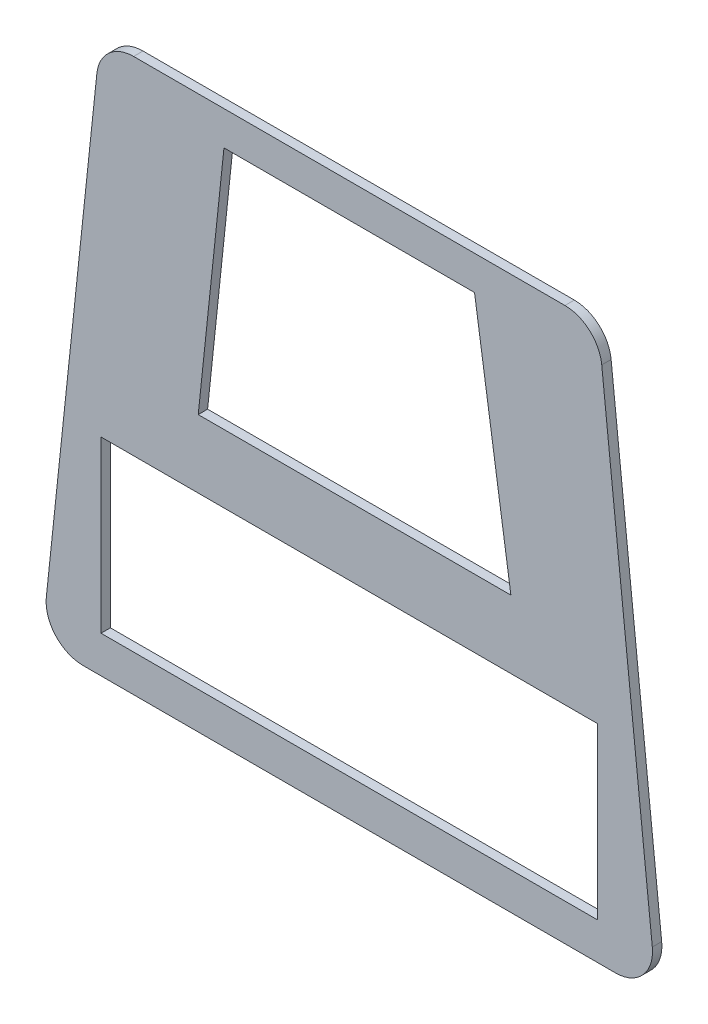
ISO-10303-21;
HEADER;
FILE_DESCRIPTION(('STEP AP214'),'2;1');
FILE_NAME('part.step','',(''),(''),'','','');
FILE_SCHEMA(('AUTOMOTIVE_DESIGN { 1 0 10303 214 1 1 1 1 }'));
ENDSEC;
DATA;
#1=APPLICATION_CONTEXT('core data for automotive mechanical design processes');
#2=APPLICATION_PROTOCOL_DEFINITION('international standard','automotive_design',2000,#1);
#3=PRODUCT_CONTEXT('',#1,'mechanical');
#4=PRODUCT('Part','Part','',(#3));
#5=PRODUCT_RELATED_PRODUCT_CATEGORY('part','',(#4));
#6=PRODUCT_DEFINITION_FORMATION('','',#4);
#7=PRODUCT_DEFINITION_CONTEXT('part definition',#1,'design');
#8=PRODUCT_DEFINITION('design','',#6,#7);
#9=PRODUCT_DEFINITION_SHAPE('','',#8);
#10=(LENGTH_UNIT() NAMED_UNIT(*) SI_UNIT(.MILLI.,.METRE.));
#11=(NAMED_UNIT(*) PLANE_ANGLE_UNIT() SI_UNIT($,.RADIAN.));
#12=(NAMED_UNIT(*) SI_UNIT($,.STERADIAN.) SOLID_ANGLE_UNIT());
#13=UNCERTAINTY_MEASURE_WITH_UNIT(LENGTH_MEASURE(1.E-05),#10,'distance_accuracy_value','');
#14=(GEOMETRIC_REPRESENTATION_CONTEXT(3) GLOBAL_UNCERTAINTY_ASSIGNED_CONTEXT((#13)) GLOBAL_UNIT_ASSIGNED_CONTEXT((#10,
#11,#12)) REPRESENTATION_CONTEXT('',''));
#15=CARTESIAN_POINT('',(0.,0.,0.));
#16=DIRECTION('',(0.,0.,1.));
#17=DIRECTION('',(1.,0.,0.));
#18=AXIS2_PLACEMENT_3D('',#15,#16,#17);
#19=CARTESIAN_POINT('',(180.142857142854,-243.5,6.35));
#20=DIRECTION('',(0.,0.,1.));
#21=DIRECTION('',(1.,0.,0.));
#22=AXIS2_PLACEMENT_3D('',#19,#20,#21);
#23=PLANE('',#22);
#24=DIRECTION('',(-0.105006313285611,-0.994471555234319,0.));
#25=VECTOR('',#24,1.);
#26=CARTESIAN_POINT('',(-84.799938232529,82.5,6.35));
#27=LINE('',#26,#25);
#28=CARTESIAN_POINT('',(-84.799938232529,82.5,6.35));
#29=VERTEX_POINT('',#28);
#30=CARTESIAN_POINT('',(-102.222298480976,-82.5,6.35));
#31=VERTEX_POINT('',#30);
#32=EDGE_CURVE('E48',#29,#31,#27,.T.);
#33=ORIENTED_EDGE('',*,*,#32,.F.);
#34=DIRECTION('',(-1.,0.,0.));
#35=VECTOR('',#34,1.);
#36=CARTESIAN_POINT('',(84.7239626245148,82.5,6.35));
#37=LINE('',#36,#35);
#38=CARTESIAN_POINT('',(84.7239626245148,82.5,6.35));
#39=VERTEX_POINT('',#38);
#40=EDGE_CURVE('E164',#39,#29,#37,.T.);
#41=ORIENTED_EDGE('',*,*,#40,.F.);
#42=DIRECTION('',(-0.147439173889975,0.989071124845247,0.));
#43=VECTOR('',#42,1.);
#44=CARTESIAN_POINT('',(109.32023591644,-82.5,6.35));
#45=LINE('',#44,#43);
#46=CARTESIAN_POINT('',(109.32023591644,-82.5,6.35));
#47=VERTEX_POINT('',#46);
#48=EDGE_CURVE('E167',#47,#39,#45,.T.);
#49=ORIENTED_EDGE('',*,*,#48,.F.);
#50=DIRECTION('',(1.,0.,0.));
#51=VECTOR('',#50,1.);
#52=CARTESIAN_POINT('',(-102.222298480976,-82.5,6.35));
#53=LINE('',#52,#51);
#54=EDGE_CURVE('E173',#31,#47,#53,.T.);
#55=ORIENTED_EDGE('',*,*,#54,.F.);
#56=EDGE_LOOP('',(#33,#41,#49,#55));
#57=FACE_BOUND('',#56,.T.);
#58=CARTESIAN_POINT('',(180.142857142854,-243.5,6.35));
#59=DIRECTION('',(0.,0.,1.));
#60=DIRECTION('',(1.,0.,0.));
#61=AXIS2_PLACEMENT_3D('',#58,#59,#60);
#62=CIRCLE('',#61,25.0000000000015);
#63=CARTESIAN_POINT('',(180.142857142854,-268.5,6.35));
#64=VERTEX_POINT('',#63);
#65=CARTESIAN_POINT('',(205.004646023715,-240.87484216786,6.35));
#66=VERTEX_POINT('',#65);
#67=EDGE_CURVE('E214',#64,#66,#62,.T.);
#68=ORIENTED_EDGE('',*,*,#67,.T.);
#69=DIRECTION('',(-0.105006313285609,0.994471555234319,0.));
#70=VECTOR('',#69,1.);
#71=CARTESIAN_POINT('',(205.004646023715,-240.87484216786,6.35));
#72=LINE('',#71,#70);
#73=CARTESIAN_POINT('',(170.793465899491,83.1251578321402,6.35));
#74=VERTEX_POINT('',#73);
#75=EDGE_CURVE('E217',#66,#74,#72,.T.);
#76=ORIENTED_EDGE('',*,*,#75,.T.);
#77=CARTESIAN_POINT('',(145.931677018633,80.5,6.35));
#78=DIRECTION('',(0.,0.,1.));
#79=DIRECTION('',(-1.,0.,0.));
#80=AXIS2_PLACEMENT_3D('',#77,#78,#79);
#81=CIRCLE('',#80,25.0000000000001);
#82=CARTESIAN_POINT('',(145.931677018633,105.5,6.35));
#83=VERTEX_POINT('',#82);
#84=EDGE_CURVE('E220',#74,#83,#81,.T.);
#85=ORIENTED_EDGE('',*,*,#84,.T.);
#86=DIRECTION('',(-1.,0.,0.));
#87=VECTOR('',#86,1.);
#88=CARTESIAN_POINT('',(145.931677018633,105.5,6.35));
#89=LINE('',#88,#87);
#90=CARTESIAN_POINT('',(-145.931677018633,105.5,6.35));
#91=VERTEX_POINT('',#90);
#92=EDGE_CURVE('E222',#83,#91,#89,.T.);
#93=ORIENTED_EDGE('',*,*,#92,.T.);
#94=CARTESIAN_POINT('',(-145.931677018634,80.4999999999999,6.35));
#95=DIRECTION('',(0.,0.,1.));
#96=DIRECTION('',(1.,0.,0.));
#97=AXIS2_PLACEMENT_3D('',#94,#95,#96);
#98=CIRCLE('',#97,25.);
#99=CARTESIAN_POINT('',(-170.793465899492,83.1251578321401,6.35));
#100=VERTEX_POINT('',#99);
#101=EDGE_CURVE('E224',#91,#100,#98,.T.);
#102=ORIENTED_EDGE('',*,*,#101,.T.);
#103=DIRECTION('',(-0.105006313285611,-0.994471555234319,0.));
#104=VECTOR('',#103,1.);
#105=CARTESIAN_POINT('',(-170.793465899492,83.1251578321401,6.35));
#106=LINE('',#105,#104);
#107=CARTESIAN_POINT('',(-205.004646023715,-240.87484216786,6.35));
#108=VERTEX_POINT('',#107);
#109=EDGE_CURVE('E226',#100,#108,#106,.T.);
#110=ORIENTED_EDGE('',*,*,#109,.T.);
#111=CARTESIAN_POINT('',(-180.142857142857,-243.5,6.35));
#112=DIRECTION('',(0.,0.,1.));
#113=DIRECTION('',(1.,0.,0.));
#114=AXIS2_PLACEMENT_3D('',#111,#112,#113);
#115=CIRCLE('',#114,25.);
#116=CARTESIAN_POINT('',(-180.142857142857,-268.5,6.35));
#117=VERTEX_POINT('',#116);
#118=EDGE_CURVE('E228',#108,#117,#115,.T.);
#119=ORIENTED_EDGE('',*,*,#118,.T.);
#120=DIRECTION('',(1.,0.,0.));
#121=VECTOR('',#120,1.);
#122=CARTESIAN_POINT('',(-180.142857142857,-268.5,6.35));
#123=LINE('',#122,#121);
#124=EDGE_CURVE('E230',#117,#64,#123,.T.);
#125=ORIENTED_EDGE('',*,*,#124,.T.);
#126=EDGE_LOOP('',(#68,#76,#85,#93,#102,#110,#119,#125));
#127=FACE_BOUND('',#126,.T.);
#128=DIRECTION('',(1.,0.,0.));
#129=VECTOR('',#128,1.);
#130=CARTESIAN_POINT('',(-168.,-243.5,6.35));
#131=LINE('',#130,#129);
#132=CARTESIAN_POINT('',(-168.,-243.5,6.35));
#133=VERTEX_POINT('',#132);
#134=CARTESIAN_POINT('',(168.,-243.5,6.35));
#135=VERTEX_POINT('',#134);
#136=EDGE_CURVE('E185',#133,#135,#131,.T.);
#137=ORIENTED_EDGE('',*,*,#136,.F.);
#138=DIRECTION('',(0.,-1.,0.));
#139=VECTOR('',#138,1.);
#140=CARTESIAN_POINT('',(-168.,-128.5,6.35));
#141=LINE('',#140,#139);
#142=CARTESIAN_POINT('',(-168.,-128.5,6.35));
#143=VERTEX_POINT('',#142);
#144=EDGE_CURVE('E183',#143,#133,#141,.T.);
#145=ORIENTED_EDGE('',*,*,#144,.F.);
#146=DIRECTION('',(-1.,0.,0.));
#147=VECTOR('',#146,1.);
#148=CARTESIAN_POINT('',(-168.,-128.5,6.35));
#149=LINE('',#148,#147);
#150=CARTESIAN_POINT('',(168.,-128.5,6.35));
#151=VERTEX_POINT('',#150);
#152=EDGE_CURVE('E191',#151,#143,#149,.T.);
#153=ORIENTED_EDGE('',*,*,#152,.F.);
#154=DIRECTION('',(0.,1.,0.));
#155=VECTOR('',#154,1.);
#156=CARTESIAN_POINT('',(168.,-128.5,6.35));
#157=LINE('',#156,#155);
#158=EDGE_CURVE('E188',#135,#151,#157,.T.);
#159=ORIENTED_EDGE('',*,*,#158,.F.);
#160=EDGE_LOOP('',(#137,#145,#153,#159));
#161=FACE_BOUND('',#160,.T.);
#162=ADVANCED_FACE('F33',(#57,#127,#161),#23,.T.);
#163=CARTESIAN_POINT('',(180.142857142854,-243.5,0.));
#164=DIRECTION('',(0.,0.,1.));
#165=DIRECTION('',(1.,0.,0.));
#166=AXIS2_PLACEMENT_3D('',#163,#164,#165);
#167=PLANE('',#166);
#168=DIRECTION('',(-1.,0.,0.));
#169=VECTOR('',#168,1.);
#170=CARTESIAN_POINT('',(84.7239626245148,82.5,0.));
#171=LINE('',#170,#169);
#172=CARTESIAN_POINT('',(84.7239626245148,82.5,0.));
#173=VERTEX_POINT('',#172);
#174=CARTESIAN_POINT('',(-84.799938232529,82.5,0.));
#175=VERTEX_POINT('',#174);
#176=EDGE_CURVE('E154',#173,#175,#171,.T.);
#177=ORIENTED_EDGE('',*,*,#176,.T.);
#178=DIRECTION('',(-0.105006313285611,-0.994471555234319,0.));
#179=VECTOR('',#178,1.);
#180=CARTESIAN_POINT('',(-84.799938232529,82.5,0.));
#181=LINE('',#180,#179);
#182=CARTESIAN_POINT('',(-102.222298480976,-82.5,0.));
#183=VERTEX_POINT('',#182);
#184=EDGE_CURVE('E148',#175,#183,#181,.T.);
#185=ORIENTED_EDGE('',*,*,#184,.T.);
#186=DIRECTION('',(1.,0.,0.));
#187=VECTOR('',#186,1.);
#188=CARTESIAN_POINT('',(-102.222298480976,-82.5,0.));
#189=LINE('',#188,#187);
#190=CARTESIAN_POINT('',(109.32023591644,-82.5,0.));
#191=VERTEX_POINT('',#190);
#192=EDGE_CURVE('E157',#183,#191,#189,.T.);
#193=ORIENTED_EDGE('',*,*,#192,.T.);
#194=DIRECTION('',(-0.147439173889975,0.989071124845247,0.));
#195=VECTOR('',#194,1.);
#196=CARTESIAN_POINT('',(109.32023591644,-82.5,0.));
#197=LINE('',#196,#195);
#198=EDGE_CURVE('E56',#191,#173,#197,.T.);
#199=ORIENTED_EDGE('',*,*,#198,.T.);
#200=EDGE_LOOP('',(#177,#185,#193,#199));
#201=FACE_BOUND('',#200,.T.);
#202=CARTESIAN_POINT('',(180.142857142854,-243.5,0.));
#203=DIRECTION('',(0.,0.,1.));
#204=DIRECTION('',(1.,0.,0.));
#205=AXIS2_PLACEMENT_3D('',#202,#203,#204);
#206=CIRCLE('',#205,25.0000000000015);
#207=CARTESIAN_POINT('',(180.142857142854,-268.5,0.));
#208=VERTEX_POINT('',#207);
#209=CARTESIAN_POINT('',(205.004646023715,-240.87484216786,0.));
#210=VERTEX_POINT('',#209);
#211=EDGE_CURVE('E213',#208,#210,#206,.T.);
#212=ORIENTED_EDGE('',*,*,#211,.F.);
#213=DIRECTION('',(1.,0.,0.));
#214=VECTOR('',#213,1.);
#215=CARTESIAN_POINT('',(-180.142857142857,-268.5,0.));
#216=LINE('',#215,#214);
#217=CARTESIAN_POINT('',(-180.142857142857,-268.5,0.));
#218=VERTEX_POINT('',#217);
#219=EDGE_CURVE('E218',#218,#208,#216,.T.);
#220=ORIENTED_EDGE('',*,*,#219,.F.);
#221=CARTESIAN_POINT('',(-180.142857142857,-243.5,0.));
#222=DIRECTION('',(0.,0.,1.));
#223=DIRECTION('',(1.,0.,0.));
#224=AXIS2_PLACEMENT_3D('',#221,#222,#223);
#225=CIRCLE('',#224,25.);
#226=CARTESIAN_POINT('',(-205.004646023715,-240.87484216786,0.));
#227=VERTEX_POINT('',#226);
#228=EDGE_CURVE('E245',#227,#218,#225,.T.);
#229=ORIENTED_EDGE('',*,*,#228,.F.);
#230=DIRECTION('',(-0.105006313285611,-0.994471555234319,0.));
#231=VECTOR('',#230,1.);
#232=CARTESIAN_POINT('',(-170.793465899492,83.1251578321401,0.));
#233=LINE('',#232,#231);
#234=CARTESIAN_POINT('',(-170.793465899492,83.1251578321401,0.));
#235=VERTEX_POINT('',#234);
#236=EDGE_CURVE('E243',#235,#227,#233,.T.);
#237=ORIENTED_EDGE('',*,*,#236,.F.);
#238=CARTESIAN_POINT('',(-145.931677018634,80.4999999999999,0.));
#239=DIRECTION('',(0.,0.,1.));
#240=DIRECTION('',(1.,0.,0.));
#241=AXIS2_PLACEMENT_3D('',#238,#239,#240);
#242=CIRCLE('',#241,25.);
#243=CARTESIAN_POINT('',(-145.931677018633,105.5,0.));
#244=VERTEX_POINT('',#243);
#245=EDGE_CURVE('E241',#244,#235,#242,.T.);
#246=ORIENTED_EDGE('',*,*,#245,.F.);
#247=DIRECTION('',(-1.,0.,0.));
#248=VECTOR('',#247,1.);
#249=CARTESIAN_POINT('',(145.931677018633,105.5,0.));
#250=LINE('',#249,#248);
#251=CARTESIAN_POINT('',(145.931677018633,105.5,0.));
#252=VERTEX_POINT('',#251);
#253=EDGE_CURVE('E239',#252,#244,#250,.T.);
#254=ORIENTED_EDGE('',*,*,#253,.F.);
#255=CARTESIAN_POINT('',(145.931677018633,80.5,0.));
#256=DIRECTION('',(0.,0.,1.));
#257=DIRECTION('',(-1.,0.,0.));
#258=AXIS2_PLACEMENT_3D('',#255,#256,#257);
#259=CIRCLE('',#258,25.0000000000001);
#260=CARTESIAN_POINT('',(170.793465899491,83.1251578321402,0.));
#261=VERTEX_POINT('',#260);
#262=EDGE_CURVE('E237',#261,#252,#259,.T.);
#263=ORIENTED_EDGE('',*,*,#262,.F.);
#264=DIRECTION('',(-0.105006313285609,0.994471555234319,0.));
#265=VECTOR('',#264,1.);
#266=CARTESIAN_POINT('',(205.004646023715,-240.87484216786,0.));
#267=LINE('',#266,#265);
#268=EDGE_CURVE('E235',#210,#261,#267,.T.);
#269=ORIENTED_EDGE('',*,*,#268,.F.);
#270=EDGE_LOOP('',(#212,#220,#229,#237,#246,#254,#263,#269));
#271=FACE_BOUND('',#270,.T.);
#272=DIRECTION('',(0.,-1.,0.));
#273=VECTOR('',#272,1.);
#274=CARTESIAN_POINT('',(-168.,-128.5,0.));
#275=LINE('',#274,#273);
#276=CARTESIAN_POINT('',(-168.,-128.5,0.));
#277=VERTEX_POINT('',#276);
#278=CARTESIAN_POINT('',(-168.,-243.5,0.));
#279=VERTEX_POINT('',#278);
#280=EDGE_CURVE('E179',#277,#279,#275,.T.);
#281=ORIENTED_EDGE('',*,*,#280,.T.);
#282=DIRECTION('',(1.,0.,0.));
#283=VECTOR('',#282,1.);
#284=CARTESIAN_POINT('',(-168.,-243.5,0.));
#285=LINE('',#284,#283);
#286=CARTESIAN_POINT('',(168.,-243.5,0.));
#287=VERTEX_POINT('',#286);
#288=EDGE_CURVE('E196',#279,#287,#285,.T.);
#289=ORIENTED_EDGE('',*,*,#288,.T.);
#290=DIRECTION('',(0.,1.,0.));
#291=VECTOR('',#290,1.);
#292=CARTESIAN_POINT('',(168.,-128.5,0.));
#293=LINE('',#292,#291);
#294=CARTESIAN_POINT('',(168.,-128.5,0.));
#295=VERTEX_POINT('',#294);
#296=EDGE_CURVE('E199',#287,#295,#293,.T.);
#297=ORIENTED_EDGE('',*,*,#296,.T.);
#298=DIRECTION('',(-1.,0.,0.));
#299=VECTOR('',#298,1.);
#300=CARTESIAN_POINT('',(-168.,-128.5,0.));
#301=LINE('',#300,#299);
#302=EDGE_CURVE('E186',#295,#277,#301,.T.);
#303=ORIENTED_EDGE('',*,*,#302,.T.);
#304=EDGE_LOOP('',(#281,#289,#297,#303));
#305=FACE_BOUND('',#304,.T.);
#306=ADVANCED_FACE('F161',(#201,#271,#305),#167,.F.);
#307=CARTESIAN_POINT('',(180.142857142854,-243.5,6.35));
#308=DIRECTION('',(0.,0.,-1.));
#309=DIRECTION('',(-1.,0.,0.));
#310=AXIS2_PLACEMENT_3D('',#307,#308,#309);
#311=CYLINDRICAL_SURFACE('',#310,25.0000000000015);
#312=ORIENTED_EDGE('',*,*,#211,.T.);
#313=DIRECTION('',(0.,0.,-1.));
#314=VECTOR('',#313,1.);
#315=CARTESIAN_POINT('',(205.004646023715,-240.87484216786,6.35));
#316=LINE('',#315,#314);
#317=EDGE_CURVE('E11',#66,#210,#316,.T.);
#318=ORIENTED_EDGE('',*,*,#317,.F.);
#319=ORIENTED_EDGE('',*,*,#67,.F.);
#320=DIRECTION('',(0.,0.,-1.));
#321=VECTOR('',#320,1.);
#322=CARTESIAN_POINT('',(180.142857142854,-268.5,6.35));
#323=LINE('',#322,#321);
#324=EDGE_CURVE('E232',#64,#208,#323,.T.);
#325=ORIENTED_EDGE('',*,*,#324,.T.);
#326=EDGE_LOOP('',(#312,#318,#319,#325));
#327=FACE_BOUND('',#326,.T.);
#328=ADVANCED_FACE('F35',(#327),#311,.T.);
#329=CARTESIAN_POINT('',(205.004646023715,-240.87484216786,6.35));
#330=DIRECTION('',(-0.994471555234319,-0.105006313285609,0.));
#331=DIRECTION('',(0.105006313285609,-0.994471555234319,0.));
#332=AXIS2_PLACEMENT_3D('',#329,#330,#331);
#333=PLANE('',#332);
#334=ORIENTED_EDGE('',*,*,#268,.T.);
#335=DIRECTION('',(0.,0.,-1.));
#336=VECTOR('',#335,1.);
#337=CARTESIAN_POINT('',(170.793465899491,83.1251578321402,6.35));
#338=LINE('',#337,#336);
#339=EDGE_CURVE('E41',#74,#261,#338,.T.);
#340=ORIENTED_EDGE('',*,*,#339,.F.);
#341=ORIENTED_EDGE('',*,*,#75,.F.);
#342=ORIENTED_EDGE('',*,*,#317,.T.);
#343=EDGE_LOOP('',(#334,#340,#341,#342));
#344=FACE_BOUND('',#343,.T.);
#345=ADVANCED_FACE('F291',(#344),#333,.F.);
#346=CARTESIAN_POINT('',(145.931677018633,80.5,6.35));
#347=DIRECTION('',(0.,0.,-1.));
#348=DIRECTION('',(-1.,0.,0.));
#349=AXIS2_PLACEMENT_3D('',#346,#347,#348);
#350=CYLINDRICAL_SURFACE('',#349,25.0000000000001);
#351=ORIENTED_EDGE('',*,*,#262,.T.);
#352=DIRECTION('',(0.,0.,-1.));
#353=VECTOR('',#352,1.);
#354=CARTESIAN_POINT('',(145.931677018633,105.5,6.35));
#355=LINE('',#354,#353);
#356=EDGE_CURVE('E262',#83,#252,#355,.T.);
#357=ORIENTED_EDGE('',*,*,#356,.F.);
#358=ORIENTED_EDGE('',*,*,#84,.F.);
#359=ORIENTED_EDGE('',*,*,#339,.T.);
#360=EDGE_LOOP('',(#351,#357,#358,#359));
#361=FACE_BOUND('',#360,.T.);
#362=ADVANCED_FACE('F269',(#361),#350,.T.);
#363=CARTESIAN_POINT('',(145.931677018633,105.5,6.35));
#364=DIRECTION('',(0.,-1.,0.));
#365=DIRECTION('',(1.,0.,0.));
#366=AXIS2_PLACEMENT_3D('',#363,#364,#365);
#367=PLANE('',#366);
#368=ORIENTED_EDGE('',*,*,#253,.T.);
#369=DIRECTION('',(0.,0.,-1.));
#370=VECTOR('',#369,1.);
#371=CARTESIAN_POINT('',(-145.931677018633,105.5,6.35));
#372=LINE('',#371,#370);
#373=EDGE_CURVE('E259',#91,#244,#372,.T.);
#374=ORIENTED_EDGE('',*,*,#373,.F.);
#375=ORIENTED_EDGE('',*,*,#92,.F.);
#376=ORIENTED_EDGE('',*,*,#356,.T.);
#377=EDGE_LOOP('',(#368,#374,#375,#376));
#378=FACE_BOUND('',#377,.T.);
#379=ADVANCED_FACE('F279',(#378),#367,.F.);
#380=CARTESIAN_POINT('',(-145.931677018634,80.4999999999999,6.35));
#381=DIRECTION('',(0.,0.,-1.));
#382=DIRECTION('',(-1.,0.,0.));
#383=AXIS2_PLACEMENT_3D('',#380,#381,#382);
#384=CYLINDRICAL_SURFACE('',#383,25.);
#385=ORIENTED_EDGE('',*,*,#245,.T.);
#386=DIRECTION('',(0.,0.,-1.));
#387=VECTOR('',#386,1.);
#388=CARTESIAN_POINT('',(-170.793465899492,83.1251578321401,6.35));
#389=LINE('',#388,#387);
#390=EDGE_CURVE('E256',#100,#235,#389,.T.);
#391=ORIENTED_EDGE('',*,*,#390,.F.);
#392=ORIENTED_EDGE('',*,*,#101,.F.);
#393=ORIENTED_EDGE('',*,*,#373,.T.);
#394=EDGE_LOOP('',(#385,#391,#392,#393));
#395=FACE_BOUND('',#394,.T.);
#396=ADVANCED_FACE('F283',(#395),#384,.T.);
#397=CARTESIAN_POINT('',(-170.793465899492,83.1251578321401,6.35));
#398=DIRECTION('',(0.994471555234319,-0.105006313285611,0.));
#399=DIRECTION('',(0.105006313285611,0.994471555234319,0.));
#400=AXIS2_PLACEMENT_3D('',#397,#398,#399);
#401=PLANE('',#400);
#402=ORIENTED_EDGE('',*,*,#236,.T.);
#403=DIRECTION('',(0.,0.,-1.));
#404=VECTOR('',#403,1.);
#405=CARTESIAN_POINT('',(-205.004646023715,-240.87484216786,6.35));
#406=LINE('',#405,#404);
#407=EDGE_CURVE('E253',#108,#227,#406,.T.);
#408=ORIENTED_EDGE('',*,*,#407,.F.);
#409=ORIENTED_EDGE('',*,*,#109,.F.);
#410=ORIENTED_EDGE('',*,*,#390,.T.);
#411=EDGE_LOOP('',(#402,#408,#409,#410));
#412=FACE_BOUND('',#411,.T.);
#413=ADVANCED_FACE('F304',(#412),#401,.F.);
#414=CARTESIAN_POINT('',(-180.142857142857,-243.5,6.35));
#415=DIRECTION('',(0.,0.,-1.));
#416=DIRECTION('',(-1.,0.,0.));
#417=AXIS2_PLACEMENT_3D('',#414,#415,#416);
#418=CYLINDRICAL_SURFACE('',#417,25.);
#419=ORIENTED_EDGE('',*,*,#228,.T.);
#420=DIRECTION('',(0.,0.,-1.));
#421=VECTOR('',#420,1.);
#422=CARTESIAN_POINT('',(-180.142857142857,-268.5,6.35));
#423=LINE('',#422,#421);
#424=EDGE_CURVE('E250',#117,#218,#423,.T.);
#425=ORIENTED_EDGE('',*,*,#424,.F.);
#426=ORIENTED_EDGE('',*,*,#118,.F.);
#427=ORIENTED_EDGE('',*,*,#407,.T.);
#428=EDGE_LOOP('',(#419,#425,#426,#427));
#429=FACE_BOUND('',#428,.T.);
#430=ADVANCED_FACE('F302',(#429),#418,.T.);
#431=CARTESIAN_POINT('',(-180.142857142857,-268.5,6.35));
#432=DIRECTION('',(0.,1.,0.));
#433=DIRECTION('',(-1.,0.,0.));
#434=AXIS2_PLACEMENT_3D('',#431,#432,#433);
#435=PLANE('',#434);
#436=ORIENTED_EDGE('',*,*,#219,.T.);
#437=ORIENTED_EDGE('',*,*,#324,.F.);
#438=ORIENTED_EDGE('',*,*,#124,.F.);
#439=ORIENTED_EDGE('',*,*,#424,.T.);
#440=EDGE_LOOP('',(#436,#437,#438,#439));
#441=FACE_BOUND('',#440,.T.);
#442=ADVANCED_FACE('F297',(#441),#435,.F.);
#443=CARTESIAN_POINT('',(-168.,-128.5,6.35));
#444=DIRECTION('',(1.,0.,0.));
#445=DIRECTION('',(0.,1.,0.));
#446=AXIS2_PLACEMENT_3D('',#443,#444,#445);
#447=PLANE('',#446);
#448=ORIENTED_EDGE('',*,*,#280,.F.);
#449=DIRECTION('',(0.,0.,-1.));
#450=VECTOR('',#449,1.);
#451=CARTESIAN_POINT('',(-168.,-128.5,6.35));
#452=LINE('',#451,#450);
#453=EDGE_CURVE('E193',#143,#277,#452,.T.);
#454=ORIENTED_EDGE('',*,*,#453,.F.);
#455=ORIENTED_EDGE('',*,*,#144,.T.);
#456=DIRECTION('',(0.,0.,-1.));
#457=VECTOR('',#456,1.);
#458=CARTESIAN_POINT('',(-168.,-243.5,6.35));
#459=LINE('',#458,#457);
#460=EDGE_CURVE('E210',#133,#279,#459,.T.);
#461=ORIENTED_EDGE('',*,*,#460,.T.);
#462=EDGE_LOOP('',(#448,#454,#455,#461));
#463=FACE_BOUND('',#462,.T.);
#464=ADVANCED_FACE('F321',(#463),#447,.T.);
#465=CARTESIAN_POINT('',(-168.,-243.5,6.35));
#466=DIRECTION('',(0.,1.,0.));
#467=DIRECTION('',(-1.,0.,0.));
#468=AXIS2_PLACEMENT_3D('',#465,#466,#467);
#469=PLANE('',#468);
#470=ORIENTED_EDGE('',*,*,#288,.F.);
#471=ORIENTED_EDGE('',*,*,#460,.F.);
#472=ORIENTED_EDGE('',*,*,#136,.T.);
#473=DIRECTION('',(0.,0.,-1.));
#474=VECTOR('',#473,1.);
#475=CARTESIAN_POINT('',(168.,-243.5,6.35));
#476=LINE('',#475,#474);
#477=EDGE_CURVE('E208',#135,#287,#476,.T.);
#478=ORIENTED_EDGE('',*,*,#477,.T.);
#479=EDGE_LOOP('',(#470,#471,#472,#478));
#480=FACE_BOUND('',#479,.T.);
#481=ADVANCED_FACE('F328',(#480),#469,.T.);
#482=CARTESIAN_POINT('',(168.,-128.5,6.35));
#483=DIRECTION('',(-1.,0.,0.));
#484=DIRECTION('',(0.,-1.,0.));
#485=AXIS2_PLACEMENT_3D('',#482,#483,#484);
#486=PLANE('',#485);
#487=ORIENTED_EDGE('',*,*,#296,.F.);
#488=ORIENTED_EDGE('',*,*,#477,.F.);
#489=ORIENTED_EDGE('',*,*,#158,.T.);
#490=DIRECTION('',(0.,0.,-1.));
#491=VECTOR('',#490,1.);
#492=CARTESIAN_POINT('',(168.,-128.5,6.35));
#493=LINE('',#492,#491);
#494=EDGE_CURVE('E206',#151,#295,#493,.T.);
#495=ORIENTED_EDGE('',*,*,#494,.T.);
#496=EDGE_LOOP('',(#487,#488,#489,#495));
#497=FACE_BOUND('',#496,.T.);
#498=ADVANCED_FACE('F333',(#497),#486,.T.);
#499=CARTESIAN_POINT('',(-168.,-128.5,6.35));
#500=DIRECTION('',(0.,-1.,0.));
#501=DIRECTION('',(0.,0.,-1.));
#502=AXIS2_PLACEMENT_3D('',#499,#500,#501);
#503=PLANE('',#502);
#504=ORIENTED_EDGE('',*,*,#302,.F.);
#505=ORIENTED_EDGE('',*,*,#494,.F.);
#506=ORIENTED_EDGE('',*,*,#152,.T.);
#507=ORIENTED_EDGE('',*,*,#453,.T.);
#508=EDGE_LOOP('',(#504,#505,#506,#507));
#509=FACE_BOUND('',#508,.T.);
#510=ADVANCED_FACE('F340',(#509),#503,.T.);
#511=CARTESIAN_POINT('',(-84.799938232529,82.5,0.));
#512=DIRECTION('',(-0.994471555234319,0.105006313285611,0.));
#513=DIRECTION('',(-0.105006313285611,-0.994471555234319,0.));
#514=AXIS2_PLACEMENT_3D('',#511,#512,#513);
#515=PLANE('',#514);
#516=ORIENTED_EDGE('',*,*,#32,.T.);
#517=DIRECTION('',(0.,0.,1.));
#518=VECTOR('',#517,1.);
#519=CARTESIAN_POINT('',(-102.222298480976,-82.5,0.));
#520=LINE('',#519,#518);
#521=EDGE_CURVE('E144',#183,#31,#520,.T.);
#522=ORIENTED_EDGE('',*,*,#521,.F.);
#523=ORIENTED_EDGE('',*,*,#184,.F.);
#524=DIRECTION('',(0.,0.,1.));
#525=VECTOR('',#524,1.);
#526=CARTESIAN_POINT('',(-84.799938232529,82.5,0.));
#527=LINE('',#526,#525);
#528=EDGE_CURVE('E177',#175,#29,#527,.T.);
#529=ORIENTED_EDGE('',*,*,#528,.T.);
#530=EDGE_LOOP('',(#516,#522,#523,#529));
#531=FACE_BOUND('',#530,.T.);
#532=ADVANCED_FACE('F146',(#531),#515,.F.);
#533=CARTESIAN_POINT('',(84.7239626245148,82.5,0.));
#534=DIRECTION('',(0.,1.,0.));
#535=DIRECTION('',(0.,0.,1.));
#536=AXIS2_PLACEMENT_3D('',#533,#534,#535);
#537=PLANE('',#536);
#538=ORIENTED_EDGE('',*,*,#40,.T.);
#539=ORIENTED_EDGE('',*,*,#528,.F.);
#540=ORIENTED_EDGE('',*,*,#176,.F.);
#541=DIRECTION('',(0.,0.,1.));
#542=VECTOR('',#541,1.);
#543=CARTESIAN_POINT('',(84.7239626245148,82.5,0.));
#544=LINE('',#543,#542);
#545=EDGE_CURVE('E180',#173,#39,#544,.T.);
#546=ORIENTED_EDGE('',*,*,#545,.T.);
#547=EDGE_LOOP('',(#538,#539,#540,#546));
#548=FACE_BOUND('',#547,.T.);
#549=ADVANCED_FACE('F356',(#548),#537,.F.);
#550=CARTESIAN_POINT('',(109.32023591644,-82.5,0.));
#551=DIRECTION('',(0.989071124845247,0.147439173889975,0.));
#552=DIRECTION('',(-0.147439173889975,0.989071124845247,0.));
#553=AXIS2_PLACEMENT_3D('',#550,#551,#552);
#554=PLANE('',#553);
#555=ORIENTED_EDGE('',*,*,#48,.T.);
#556=ORIENTED_EDGE('',*,*,#545,.F.);
#557=ORIENTED_EDGE('',*,*,#198,.F.);
#558=DIRECTION('',(0.,0.,1.));
#559=VECTOR('',#558,1.);
#560=CARTESIAN_POINT('',(109.32023591644,-82.5,0.));
#561=LINE('',#560,#559);
#562=EDGE_CURVE('E153',#191,#47,#561,.T.);
#563=ORIENTED_EDGE('',*,*,#562,.T.);
#564=EDGE_LOOP('',(#555,#556,#557,#563));
#565=FACE_BOUND('',#564,.T.);
#566=ADVANCED_FACE('F359',(#565),#554,.F.);
#567=CARTESIAN_POINT('',(-102.222298480976,-82.5,0.));
#568=DIRECTION('',(0.,-1.,0.));
#569=DIRECTION('',(0.,0.,-1.));
#570=AXIS2_PLACEMENT_3D('',#567,#568,#569);
#571=PLANE('',#570);
#572=ORIENTED_EDGE('',*,*,#54,.T.);
#573=ORIENTED_EDGE('',*,*,#562,.F.);
#574=ORIENTED_EDGE('',*,*,#192,.F.);
#575=ORIENTED_EDGE('',*,*,#521,.T.);
#576=EDGE_LOOP('',(#572,#573,#574,#575));
#577=FACE_BOUND('',#576,.T.);
#578=ADVANCED_FACE('F158',(#577),#571,.F.);
#579=CLOSED_SHELL('',(#162,#306,#328,#345,#362,#379,#396,#413,#430,#442,#464,#481,#498,#510,
#532,#549,#566,#578));
#580=MANIFOLD_SOLID_BREP('B2',#579);
#581=ADVANCED_BREP_SHAPE_REPRESENTATION('',(#18,#580),#14);
#582=SHAPE_DEFINITION_REPRESENTATION(#9,#581);
ENDSEC;
END-ISO-10303-21;
